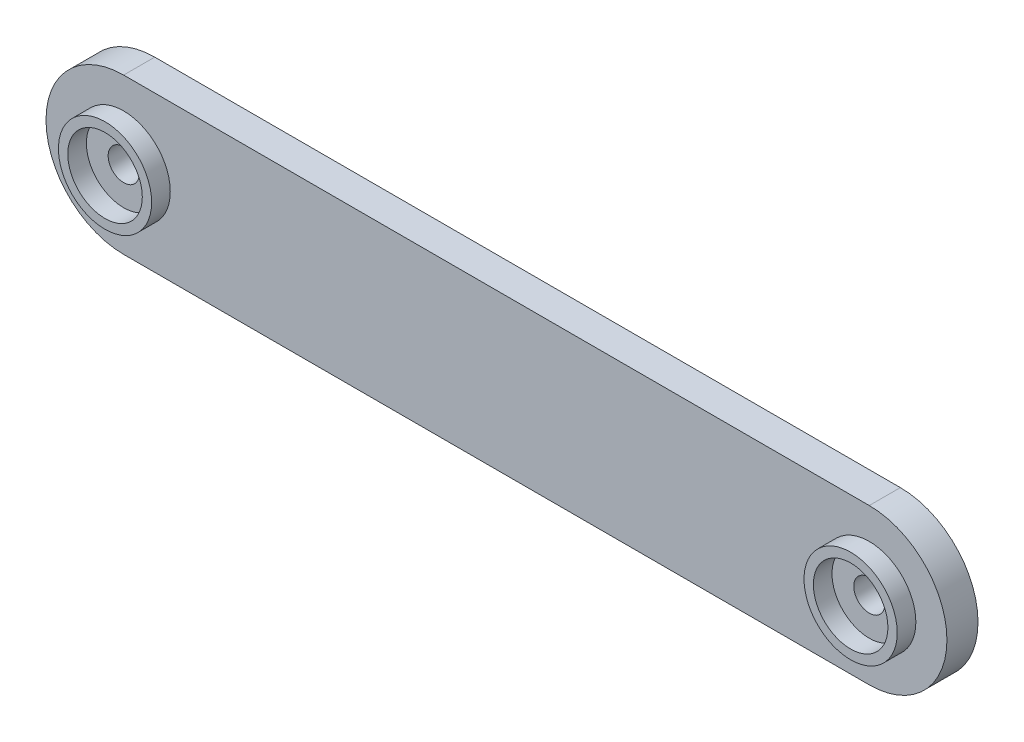
ISO-10303-21;
HEADER;
FILE_DESCRIPTION(('STEP AP214'),'2;1');
FILE_NAME('part.step','',(''),(''),'','','');
FILE_SCHEMA(('AUTOMOTIVE_DESIGN { 1 0 10303 214 1 1 1 1 }'));
ENDSEC;
DATA;
#1=APPLICATION_CONTEXT('core data for automotive mechanical design processes');
#2=APPLICATION_PROTOCOL_DEFINITION('international standard','automotive_design',2000,#1);
#3=PRODUCT_CONTEXT('',#1,'mechanical');
#4=PRODUCT('Part','Part','',(#3));
#5=PRODUCT_RELATED_PRODUCT_CATEGORY('part','',(#4));
#6=PRODUCT_DEFINITION_FORMATION('','',#4);
#7=PRODUCT_DEFINITION_CONTEXT('part definition',#1,'design');
#8=PRODUCT_DEFINITION('design','',#6,#7);
#9=PRODUCT_DEFINITION_SHAPE('','',#8);
#10=(LENGTH_UNIT() NAMED_UNIT(*) SI_UNIT(.MILLI.,.METRE.));
#11=(NAMED_UNIT(*) PLANE_ANGLE_UNIT() SI_UNIT($,.RADIAN.));
#12=(NAMED_UNIT(*) SI_UNIT($,.STERADIAN.) SOLID_ANGLE_UNIT());
#13=UNCERTAINTY_MEASURE_WITH_UNIT(LENGTH_MEASURE(1.E-05),#10,'distance_accuracy_value','');
#14=(GEOMETRIC_REPRESENTATION_CONTEXT(3) GLOBAL_UNCERTAINTY_ASSIGNED_CONTEXT((#13)) GLOBAL_UNIT_ASSIGNED_CONTEXT((#10,
#11,#12)) REPRESENTATION_CONTEXT('',''));
#15=CARTESIAN_POINT('',(0.,0.,0.));
#16=DIRECTION('',(0.,0.,1.));
#17=DIRECTION('',(1.,0.,0.));
#18=AXIS2_PLACEMENT_3D('',#15,#16,#17);
#19=CARTESIAN_POINT('',(0.,0.,5.));
#20=DIRECTION('',(0.,0.,1.));
#21=DIRECTION('',(1.,0.,0.));
#22=AXIS2_PLACEMENT_3D('',#19,#20,#21);
#23=PLANE('',#22);
#24=CARTESIAN_POINT('',(0.,12.5,5.));
#25=DIRECTION('',(0.,0.,1.));
#26=DIRECTION('',(1.,0.,0.));
#27=AXIS2_PLACEMENT_3D('',#24,#25,#26);
#28=CIRCLE('',#27,2.5);
#29=CARTESIAN_POINT('',(2.5,12.5,5.));
#30=VERTEX_POINT('',#29);
#31=EDGE_CURVE('E198',#30,#30,#28,.T.);
#32=ORIENTED_EDGE('',*,*,#31,.F.);
#33=EDGE_LOOP('',(#32));
#34=FACE_BOUND('',#33,.T.);
#35=CARTESIAN_POINT('',(0.,12.5,5.));
#36=DIRECTION('',(0.,0.,1.));
#37=DIRECTION('',(1.,0.,0.));
#38=AXIS2_PLACEMENT_3D('',#35,#36,#37);
#39=CIRCLE('',#38,6.);
#40=CARTESIAN_POINT('',(6.,12.5,5.));
#41=VERTEX_POINT('',#40);
#42=EDGE_CURVE('E12',#41,#41,#39,.F.);
#43=ORIENTED_EDGE('',*,*,#42,.F.);
#44=EDGE_LOOP('',(#43));
#45=FACE_BOUND('',#44,.T.);
#46=ADVANCED_FACE('F75',(#34,#45),#23,.T.);
#47=CARTESIAN_POINT('',(120.,12.5,5.));
#48=DIRECTION('',(0.,0.,1.));
#49=DIRECTION('',(1.,0.,0.));
#50=AXIS2_PLACEMENT_3D('',#47,#48,#49);
#51=CIRCLE('',#50,2.50000000000001);
#52=CARTESIAN_POINT('',(122.5,12.5,5.));
#53=VERTEX_POINT('',#52);
#54=EDGE_CURVE('E201',#53,#53,#51,.T.);
#55=ORIENTED_EDGE('',*,*,#54,.F.);
#56=EDGE_LOOP('',(#55));
#57=FACE_BOUND('',#56,.T.);
#58=CARTESIAN_POINT('',(120.,12.5,5.));
#59=DIRECTION('',(0.,0.,1.));
#60=DIRECTION('',(1.,0.,0.));
#61=AXIS2_PLACEMENT_3D('',#58,#59,#60);
#62=CIRCLE('',#61,6.00000000000002);
#63=CARTESIAN_POINT('',(126.,12.5,5.));
#64=VERTEX_POINT('',#63);
#65=EDGE_CURVE('E84',#64,#64,#62,.F.);
#66=ORIENTED_EDGE('',*,*,#65,.F.);
#67=EDGE_LOOP('',(#66));
#68=FACE_BOUND('',#67,.T.);
#69=ADVANCED_FACE('F159',(#57,#68),#23,.T.);
#70=CARTESIAN_POINT('',(0.,25.,5.));
#71=DIRECTION('',(0.,1.,0.));
#72=DIRECTION('',(-1.,0.,0.));
#73=AXIS2_PLACEMENT_3D('',#70,#71,#72);
#74=PLANE('',#73);
#75=DIRECTION('',(1.,0.,0.));
#76=VECTOR('',#75,1.);
#77=CARTESIAN_POINT('',(0.,25.,0.));
#78=LINE('',#77,#76);
#79=CARTESIAN_POINT('',(0.,25.,0.));
#80=VERTEX_POINT('',#79);
#81=CARTESIAN_POINT('',(120.,25.,0.));
#82=VERTEX_POINT('',#81);
#83=EDGE_CURVE('E145',#80,#82,#78,.T.);
#84=ORIENTED_EDGE('',*,*,#83,.F.);
#85=DIRECTION('',(0.,0.,-1.));
#86=VECTOR('',#85,1.);
#87=CARTESIAN_POINT('',(0.,25.,5.));
#88=LINE('',#87,#86);
#89=CARTESIAN_POINT('',(0.,25.,5.));
#90=VERTEX_POINT('',#89);
#91=EDGE_CURVE('E92',#90,#80,#88,.T.);
#92=ORIENTED_EDGE('',*,*,#91,.F.);
#93=DIRECTION('',(1.,0.,0.));
#94=VECTOR('',#93,1.);
#95=CARTESIAN_POINT('',(0.,25.,5.));
#96=LINE('',#95,#94);
#97=CARTESIAN_POINT('',(120.,25.,5.));
#98=VERTEX_POINT('',#97);
#99=EDGE_CURVE('E139',#90,#98,#96,.T.);
#100=ORIENTED_EDGE('',*,*,#99,.T.);
#101=DIRECTION('',(0.,0.,-1.));
#102=VECTOR('',#101,1.);
#103=CARTESIAN_POINT('',(120.,25.,5.));
#104=LINE('',#103,#102);
#105=EDGE_CURVE('E119',#98,#82,#104,.T.);
#106=ORIENTED_EDGE('',*,*,#105,.T.);
#107=EDGE_LOOP('',(#84,#92,#100,#106));
#108=FACE_BOUND('',#107,.T.);
#109=ADVANCED_FACE('F161',(#108),#74,.T.);
#110=CARTESIAN_POINT('',(0.,0.,5.));
#111=DIRECTION('',(0.,1.,0.));
#112=DIRECTION('',(0.,0.,1.));
#113=AXIS2_PLACEMENT_3D('',#110,#111,#112);
#114=PLANE('',#113);
#115=DIRECTION('',(1.,0.,0.));
#116=VECTOR('',#115,1.);
#117=CARTESIAN_POINT('',(0.,0.,0.));
#118=LINE('',#117,#116);
#119=CARTESIAN_POINT('',(0.,0.,0.));
#120=VERTEX_POINT('',#119);
#121=CARTESIAN_POINT('',(120.,0.,0.));
#122=VERTEX_POINT('',#121);
#123=EDGE_CURVE('E127',#120,#122,#118,.T.);
#124=ORIENTED_EDGE('',*,*,#123,.T.);
#125=DIRECTION('',(0.,0.,-1.));
#126=VECTOR('',#125,1.);
#127=CARTESIAN_POINT('',(120.,0.,5.));
#128=LINE('',#127,#126);
#129=CARTESIAN_POINT('',(120.,0.,5.));
#130=VERTEX_POINT('',#129);
#131=EDGE_CURVE('E122',#130,#122,#128,.T.);
#132=ORIENTED_EDGE('',*,*,#131,.F.);
#133=DIRECTION('',(1.,0.,0.));
#134=VECTOR('',#133,1.);
#135=CARTESIAN_POINT('',(0.,0.,5.));
#136=LINE('',#135,#134);
#137=CARTESIAN_POINT('',(0.,0.,5.));
#138=VERTEX_POINT('',#137);
#139=EDGE_CURVE('E125',#138,#130,#136,.T.);
#140=ORIENTED_EDGE('',*,*,#139,.F.);
#141=DIRECTION('',(0.,0.,-1.));
#142=VECTOR('',#141,1.);
#143=CARTESIAN_POINT('',(0.,0.,5.));
#144=LINE('',#143,#142);
#145=EDGE_CURVE('E109',#138,#120,#144,.T.);
#146=ORIENTED_EDGE('',*,*,#145,.T.);
#147=EDGE_LOOP('',(#124,#132,#140,#146));
#148=FACE_BOUND('',#147,.T.);
#149=ADVANCED_FACE('F123',(#148),#114,.F.);
#150=CARTESIAN_POINT('',(0.,0.,0.));
#151=DIRECTION('',(0.,0.,1.));
#152=DIRECTION('',(1.,0.,0.));
#153=AXIS2_PLACEMENT_3D('',#150,#151,#152);
#154=PLANE('',#153);
#155=CARTESIAN_POINT('',(0.,12.5,0.));
#156=DIRECTION('',(0.,0.,1.));
#157=DIRECTION('',(1.,0.,0.));
#158=AXIS2_PLACEMENT_3D('',#155,#156,#157);
#159=CIRCLE('',#158,2.5);
#160=CARTESIAN_POINT('',(2.5,12.5,0.));
#161=VERTEX_POINT('',#160);
#162=EDGE_CURVE('E153',#161,#161,#159,.F.);
#163=ORIENTED_EDGE('',*,*,#162,.F.);
#164=EDGE_LOOP('',(#163));
#165=FACE_BOUND('',#164,.T.);
#166=CARTESIAN_POINT('',(120.,12.5,0.));
#167=DIRECTION('',(0.,0.,1.));
#168=DIRECTION('',(1.,0.,0.));
#169=AXIS2_PLACEMENT_3D('',#166,#167,#168);
#170=CIRCLE('',#169,2.50000000000001);
#171=CARTESIAN_POINT('',(122.5,12.5,0.));
#172=VERTEX_POINT('',#171);
#173=EDGE_CURVE('E204',#172,#172,#170,.F.);
#174=ORIENTED_EDGE('',*,*,#173,.F.);
#175=EDGE_LOOP('',(#174));
#176=FACE_BOUND('',#175,.T.);
#177=ORIENTED_EDGE('',*,*,#123,.F.);
#178=CARTESIAN_POINT('',(0.,12.5,0.));
#179=DIRECTION('',(0.,0.,1.));
#180=DIRECTION('',(1.,0.,0.));
#181=AXIS2_PLACEMENT_3D('',#178,#179,#180);
#182=CIRCLE('',#181,12.5);
#183=EDGE_CURVE('E133',#80,#120,#182,.T.);
#184=ORIENTED_EDGE('',*,*,#183,.F.);
#185=ORIENTED_EDGE('',*,*,#83,.T.);
#186=CARTESIAN_POINT('',(120.,12.5,0.));
#187=DIRECTION('',(0.,0.,1.));
#188=DIRECTION('',(1.,0.,0.));
#189=AXIS2_PLACEMENT_3D('',#186,#187,#188);
#190=CIRCLE('',#189,12.5);
#191=EDGE_CURVE('E134',#122,#82,#190,.T.);
#192=ORIENTED_EDGE('',*,*,#191,.F.);
#193=EDGE_LOOP('',(#177,#184,#185,#192));
#194=FACE_BOUND('',#193,.T.);
#195=ADVANCED_FACE('F174',(#165,#176,#194),#154,.F.);
#196=CARTESIAN_POINT('',(0.,12.5,5.));
#197=DIRECTION('',(0.,0.,1.));
#198=DIRECTION('',(1.,0.,0.));
#199=AXIS2_PLACEMENT_3D('',#196,#197,#198);
#200=CIRCLE('',#199,7.5);
#201=CARTESIAN_POINT('',(7.5,12.5,5.));
#202=VERTEX_POINT('',#201);
#203=EDGE_CURVE('E186',#202,#202,#200,.T.);
#204=ORIENTED_EDGE('',*,*,#203,.F.);
#205=EDGE_LOOP('',(#204));
#206=FACE_BOUND('',#205,.T.);
#207=CARTESIAN_POINT('',(120.,12.5,5.));
#208=DIRECTION('',(0.,0.,1.));
#209=DIRECTION('',(1.,0.,0.));
#210=AXIS2_PLACEMENT_3D('',#207,#208,#209);
#211=CIRCLE('',#210,7.50000000000001);
#212=CARTESIAN_POINT('',(127.5,12.5,5.));
#213=VERTEX_POINT('',#212);
#214=EDGE_CURVE('E189',#213,#213,#211,.T.);
#215=ORIENTED_EDGE('',*,*,#214,.F.);
#216=EDGE_LOOP('',(#215));
#217=FACE_BOUND('',#216,.T.);
#218=ORIENTED_EDGE('',*,*,#99,.F.);
#219=CARTESIAN_POINT('',(0.,12.5,5.));
#220=DIRECTION('',(0.,0.,1.));
#221=DIRECTION('',(1.,0.,0.));
#222=AXIS2_PLACEMENT_3D('',#219,#220,#221);
#223=CIRCLE('',#222,12.5);
#224=EDGE_CURVE('E138',#90,#138,#223,.T.);
#225=ORIENTED_EDGE('',*,*,#224,.T.);
#226=ORIENTED_EDGE('',*,*,#139,.T.);
#227=CARTESIAN_POINT('',(120.,12.5,5.));
#228=DIRECTION('',(0.,0.,1.));
#229=DIRECTION('',(1.,0.,0.));
#230=AXIS2_PLACEMENT_3D('',#227,#228,#229);
#231=CIRCLE('',#230,12.5);
#232=EDGE_CURVE('E130',#130,#98,#231,.T.);
#233=ORIENTED_EDGE('',*,*,#232,.T.);
#234=EDGE_LOOP('',(#218,#225,#226,#233));
#235=FACE_BOUND('',#234,.T.);
#236=ADVANCED_FACE('F137',(#206,#217,#235),#23,.T.);
#237=CARTESIAN_POINT('',(120.,12.5,5.));
#238=DIRECTION('',(0.,0.,-1.));
#239=DIRECTION('',(-1.,0.,0.));
#240=AXIS2_PLACEMENT_3D('',#237,#238,#239);
#241=CYLINDRICAL_SURFACE('',#240,12.5);
#242=ORIENTED_EDGE('',*,*,#191,.T.);
#243=ORIENTED_EDGE('',*,*,#105,.F.);
#244=ORIENTED_EDGE('',*,*,#232,.F.);
#245=ORIENTED_EDGE('',*,*,#131,.T.);
#246=EDGE_LOOP('',(#242,#243,#244,#245));
#247=FACE_BOUND('',#246,.T.);
#248=ADVANCED_FACE('F77',(#247),#241,.T.);
#249=CARTESIAN_POINT('',(0.,12.5,5.));
#250=DIRECTION('',(0.,0.,-1.));
#251=DIRECTION('',(-1.,0.,0.));
#252=AXIS2_PLACEMENT_3D('',#249,#250,#251);
#253=CYLINDRICAL_SURFACE('',#252,12.5);
#254=ORIENTED_EDGE('',*,*,#91,.T.);
#255=ORIENTED_EDGE('',*,*,#183,.T.);
#256=ORIENTED_EDGE('',*,*,#145,.F.);
#257=ORIENTED_EDGE('',*,*,#224,.F.);
#258=EDGE_LOOP('',(#254,#255,#256,#257));
#259=FACE_BOUND('',#258,.T.);
#260=ADVANCED_FACE('F180',(#259),#253,.T.);
#261=CARTESIAN_POINT('',(120.,12.5,-0.00100000000000013));
#262=DIRECTION('',(0.,0.,1.));
#263=DIRECTION('',(1.,0.,0.));
#264=AXIS2_PLACEMENT_3D('',#261,#262,#263);
#265=CYLINDRICAL_SURFACE('',#264,2.50000000000001);
#266=ORIENTED_EDGE('',*,*,#54,.T.);
#267=EDGE_LOOP('',(#266));
#268=FACE_BOUND('',#267,.T.);
#269=ORIENTED_EDGE('',*,*,#173,.T.);
#270=EDGE_LOOP('',(#269));
#271=FACE_BOUND('',#270,.T.);
#272=ADVANCED_FACE('F209',(#268,#271),#265,.F.);
#273=CARTESIAN_POINT('',(0.,12.5,-0.00100000000000013));
#274=DIRECTION('',(0.,0.,1.));
#275=DIRECTION('',(1.,0.,0.));
#276=AXIS2_PLACEMENT_3D('',#273,#274,#275);
#277=CYLINDRICAL_SURFACE('',#276,2.5);
#278=ORIENTED_EDGE('',*,*,#31,.T.);
#279=EDGE_LOOP('',(#278));
#280=FACE_BOUND('',#279,.T.);
#281=ORIENTED_EDGE('',*,*,#162,.T.);
#282=EDGE_LOOP('',(#281));
#283=FACE_BOUND('',#282,.T.);
#284=ADVANCED_FACE('F212',(#280,#283),#277,.F.);
#285=CARTESIAN_POINT('',(120.,12.5,8.));
#286=DIRECTION('',(0.,0.,-1.));
#287=DIRECTION('',(-1.,0.,0.));
#288=AXIS2_PLACEMENT_3D('',#285,#286,#287);
#289=CYLINDRICAL_SURFACE('',#288,6.00000000000002);
#290=CARTESIAN_POINT('',(120.,12.5,8.));
#291=DIRECTION('',(0.,0.,1.));
#292=DIRECTION('',(1.,0.,0.));
#293=AXIS2_PLACEMENT_3D('',#290,#291,#292);
#294=CIRCLE('',#293,6.00000000000002);
#295=CARTESIAN_POINT('',(126.,12.5,8.));
#296=VERTEX_POINT('',#295);
#297=EDGE_CURVE('E191',#296,#296,#294,.T.);
#298=ORIENTED_EDGE('',*,*,#297,.T.);
#299=EDGE_LOOP('',(#298));
#300=FACE_BOUND('',#299,.T.);
#301=ORIENTED_EDGE('',*,*,#65,.T.);
#302=EDGE_LOOP('',(#301));
#303=FACE_BOUND('',#302,.T.);
#304=ADVANCED_FACE('F157',(#300,#303),#289,.F.);
#305=CARTESIAN_POINT('',(120.,12.5,8.));
#306=DIRECTION('',(0.,0.,-1.));
#307=DIRECTION('',(-1.,0.,0.));
#308=AXIS2_PLACEMENT_3D('',#305,#306,#307);
#309=CYLINDRICAL_SURFACE('',#308,7.50000000000001);
#310=CARTESIAN_POINT('',(120.,12.5,8.));
#311=DIRECTION('',(0.,0.,1.));
#312=DIRECTION('',(1.,0.,0.));
#313=AXIS2_PLACEMENT_3D('',#310,#311,#312);
#314=CIRCLE('',#313,7.50000000000001);
#315=CARTESIAN_POINT('',(127.5,12.5,8.));
#316=VERTEX_POINT('',#315);
#317=EDGE_CURVE('E194',#316,#316,#314,.T.);
#318=ORIENTED_EDGE('',*,*,#317,.F.);
#319=EDGE_LOOP('',(#318));
#320=FACE_BOUND('',#319,.T.);
#321=ORIENTED_EDGE('',*,*,#214,.T.);
#322=EDGE_LOOP('',(#321));
#323=FACE_BOUND('',#322,.T.);
#324=ADVANCED_FACE('F272',(#320,#323),#309,.T.);
#325=CARTESIAN_POINT('',(0.,0.,8.));
#326=DIRECTION('',(0.,0.,1.));
#327=DIRECTION('',(1.,0.,0.));
#328=AXIS2_PLACEMENT_3D('',#325,#326,#327);
#329=PLANE('',#328);
#330=ORIENTED_EDGE('',*,*,#297,.F.);
#331=EDGE_LOOP('',(#330));
#332=FACE_BOUND('',#331,.T.);
#333=ORIENTED_EDGE('',*,*,#317,.T.);
#334=EDGE_LOOP('',(#333));
#335=FACE_BOUND('',#334,.T.);
#336=ADVANCED_FACE('F282',(#332,#335),#329,.T.);
#337=CARTESIAN_POINT('',(0.,12.5,8.));
#338=DIRECTION('',(0.,0.,-1.));
#339=DIRECTION('',(-1.,0.,0.));
#340=AXIS2_PLACEMENT_3D('',#337,#338,#339);
#341=CYLINDRICAL_SURFACE('',#340,6.);
#342=CARTESIAN_POINT('',(0.,12.5,8.));
#343=DIRECTION('',(0.,0.,1.));
#344=DIRECTION('',(1.,0.,0.));
#345=AXIS2_PLACEMENT_3D('',#342,#343,#344);
#346=CIRCLE('',#345,6.);
#347=CARTESIAN_POINT('',(6.,12.5,8.));
#348=VERTEX_POINT('',#347);
#349=EDGE_CURVE('E328',#348,#348,#346,.T.);
#350=ORIENTED_EDGE('',*,*,#349,.T.);
#351=EDGE_LOOP('',(#350));
#352=FACE_BOUND('',#351,.T.);
#353=ORIENTED_EDGE('',*,*,#42,.T.);
#354=EDGE_LOOP('',(#353));
#355=FACE_BOUND('',#354,.T.);
#356=ADVANCED_FACE('F292',(#352,#355),#341,.F.);
#357=CARTESIAN_POINT('',(0.,12.5,8.));
#358=DIRECTION('',(0.,0.,-1.));
#359=DIRECTION('',(-1.,0.,0.));
#360=AXIS2_PLACEMENT_3D('',#357,#358,#359);
#361=CYLINDRICAL_SURFACE('',#360,7.5);
#362=CARTESIAN_POINT('',(0.,12.5,8.));
#363=DIRECTION('',(0.,0.,1.));
#364=DIRECTION('',(1.,0.,0.));
#365=AXIS2_PLACEMENT_3D('',#362,#363,#364);
#366=CIRCLE('',#365,7.5);
#367=CARTESIAN_POINT('',(7.5,12.5,8.));
#368=VERTEX_POINT('',#367);
#369=EDGE_CURVE('E206',#368,#368,#366,.T.);
#370=ORIENTED_EDGE('',*,*,#369,.F.);
#371=EDGE_LOOP('',(#370));
#372=FACE_BOUND('',#371,.T.);
#373=ORIENTED_EDGE('',*,*,#203,.T.);
#374=EDGE_LOOP('',(#373));
#375=FACE_BOUND('',#374,.T.);
#376=ADVANCED_FACE('F302',(#372,#375),#361,.T.);
#377=CARTESIAN_POINT('',(0.,0.,8.));
#378=DIRECTION('',(0.,0.,1.));
#379=DIRECTION('',(1.,0.,0.));
#380=AXIS2_PLACEMENT_3D('',#377,#378,#379);
#381=PLANE('',#380);
#382=ORIENTED_EDGE('',*,*,#349,.F.);
#383=EDGE_LOOP('',(#382));
#384=FACE_BOUND('',#383,.T.);
#385=ORIENTED_EDGE('',*,*,#369,.T.);
#386=EDGE_LOOP('',(#385));
#387=FACE_BOUND('',#386,.T.);
#388=ADVANCED_FACE('F312',(#384,#387),#381,.T.);
#389=CLOSED_SHELL('',(#46,#69,#109,#149,#195,#236,#248,#260,#272,#284,#304,#324,#336,#356,#376,#388));
#390=MANIFOLD_SOLID_BREP('B2',#389);
#391=ADVANCED_BREP_SHAPE_REPRESENTATION('',(#18,#390),#14);
#392=SHAPE_DEFINITION_REPRESENTATION(#9,#391);
ENDSEC;
END-ISO-10303-21;
